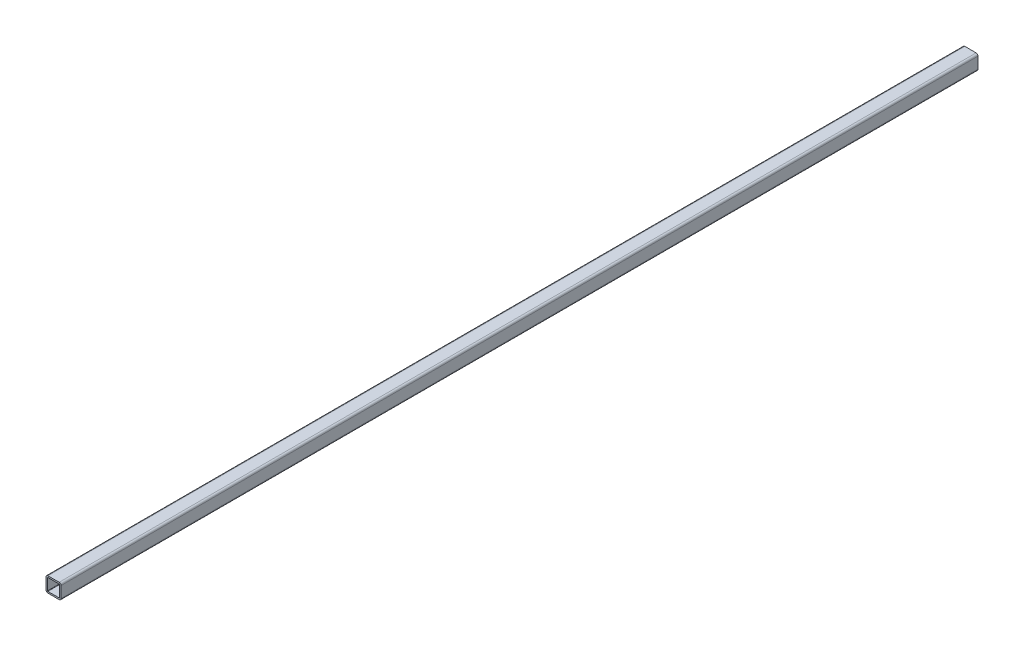
ISO-10303-21;
HEADER;
FILE_DESCRIPTION(('STEP AP214'),'2;1');
FILE_NAME('part.step','',(''),(''),'','','');
FILE_SCHEMA(('AUTOMOTIVE_DESIGN { 1 0 10303 214 1 1 1 1 }'));
ENDSEC;
DATA;
#1=APPLICATION_CONTEXT('core data for automotive mechanical design processes');
#2=APPLICATION_PROTOCOL_DEFINITION('international standard','automotive_design',2000,#1);
#3=PRODUCT_CONTEXT('',#1,'mechanical');
#4=PRODUCT('Part','Part','',(#3));
#5=PRODUCT_RELATED_PRODUCT_CATEGORY('part','',(#4));
#6=PRODUCT_DEFINITION_FORMATION('','',#4);
#7=PRODUCT_DEFINITION_CONTEXT('part definition',#1,'design');
#8=PRODUCT_DEFINITION('design','',#6,#7);
#9=PRODUCT_DEFINITION_SHAPE('','',#8);
#10=(LENGTH_UNIT() NAMED_UNIT(*) SI_UNIT(.MILLI.,.METRE.));
#11=(NAMED_UNIT(*) PLANE_ANGLE_UNIT() SI_UNIT($,.RADIAN.));
#12=(NAMED_UNIT(*) SI_UNIT($,.STERADIAN.) SOLID_ANGLE_UNIT());
#13=UNCERTAINTY_MEASURE_WITH_UNIT(LENGTH_MEASURE(1.E-05),#10,'distance_accuracy_value','');
#14=(GEOMETRIC_REPRESENTATION_CONTEXT(3) GLOBAL_UNCERTAINTY_ASSIGNED_CONTEXT((#13)) GLOBAL_UNIT_ASSIGNED_CONTEXT((#10,
#11,#12)) REPRESENTATION_CONTEXT('',''));
#15=CARTESIAN_POINT('',(0.,0.,0.));
#16=DIRECTION('',(0.,0.,1.));
#17=DIRECTION('',(1.,0.,0.));
#18=AXIS2_PLACEMENT_3D('',#15,#16,#17);
#19=CARTESIAN_POINT('',(-7.5,7.5,609.6));
#20=DIRECTION('',(0.,0.,1.));
#21=DIRECTION('',(1.,0.,0.));
#22=AXIS2_PLACEMENT_3D('',#19,#20,#21);
#23=PLANE('',#22);
#24=CARTESIAN_POINT('',(-7.5,7.5,609.6));
#25=DIRECTION('',(0.,0.,1.));
#26=DIRECTION('',(1.,0.,0.));
#27=AXIS2_PLACEMENT_3D('',#24,#25,#26);
#28=CIRCLE('',#27,2.5);
#29=CARTESIAN_POINT('',(-7.5,10.,609.6));
#30=VERTEX_POINT('',#29);
#31=CARTESIAN_POINT('',(-10.,7.5,609.6));
#32=VERTEX_POINT('',#31);
#33=EDGE_CURVE('E258',#30,#32,#28,.T.);
#34=ORIENTED_EDGE('',*,*,#33,.T.);
#35=DIRECTION('',(0.,-1.,0.));
#36=VECTOR('',#35,1.);
#37=CARTESIAN_POINT('',(-10.,-7.5,609.6));
#38=LINE('',#37,#36);
#39=CARTESIAN_POINT('',(-10.,-7.5,609.6));
#40=VERTEX_POINT('',#39);
#41=EDGE_CURVE('E261',#32,#40,#38,.T.);
#42=ORIENTED_EDGE('',*,*,#41,.T.);
#43=CARTESIAN_POINT('',(-7.5,-7.5,609.6));
#44=DIRECTION('',(0.,0.,1.));
#45=DIRECTION('',(-1.,0.,0.));
#46=AXIS2_PLACEMENT_3D('',#43,#44,#45);
#47=CIRCLE('',#46,2.5);
#48=CARTESIAN_POINT('',(-7.5,-10.,609.6));
#49=VERTEX_POINT('',#48);
#50=EDGE_CURVE('E264',#40,#49,#47,.T.);
#51=ORIENTED_EDGE('',*,*,#50,.T.);
#52=DIRECTION('',(1.,0.,0.));
#53=VECTOR('',#52,1.);
#54=CARTESIAN_POINT('',(7.5,-10.,609.6));
#55=LINE('',#54,#53);
#56=CARTESIAN_POINT('',(7.5,-10.,609.6));
#57=VERTEX_POINT('',#56);
#58=EDGE_CURVE('E266',#49,#57,#55,.T.);
#59=ORIENTED_EDGE('',*,*,#58,.T.);
#60=CARTESIAN_POINT('',(7.5,-7.5,609.6));
#61=DIRECTION('',(0.,0.,1.));
#62=DIRECTION('',(1.,0.,0.));
#63=AXIS2_PLACEMENT_3D('',#60,#61,#62);
#64=CIRCLE('',#63,2.5);
#65=CARTESIAN_POINT('',(10.,-7.5,609.6));
#66=VERTEX_POINT('',#65);
#67=EDGE_CURVE('E268',#57,#66,#64,.T.);
#68=ORIENTED_EDGE('',*,*,#67,.T.);
#69=DIRECTION('',(0.,1.,0.));
#70=VECTOR('',#69,1.);
#71=CARTESIAN_POINT('',(10.,-7.5,609.6));
#72=LINE('',#71,#70);
#73=CARTESIAN_POINT('',(10.,7.5,609.6));
#74=VERTEX_POINT('',#73);
#75=EDGE_CURVE('E270',#66,#74,#72,.T.);
#76=ORIENTED_EDGE('',*,*,#75,.T.);
#77=CARTESIAN_POINT('',(7.5,7.5,609.6));
#78=DIRECTION('',(0.,0.,1.));
#79=DIRECTION('',(1.,0.,0.));
#80=AXIS2_PLACEMENT_3D('',#77,#78,#79);
#81=CIRCLE('',#80,2.5);
#82=CARTESIAN_POINT('',(7.5,10.,609.6));
#83=VERTEX_POINT('',#82);
#84=EDGE_CURVE('E272',#74,#83,#81,.T.);
#85=ORIENTED_EDGE('',*,*,#84,.T.);
#86=DIRECTION('',(-1.,0.,0.));
#87=VECTOR('',#86,1.);
#88=CARTESIAN_POINT('',(7.5,10.,609.6));
#89=LINE('',#88,#87);
#90=EDGE_CURVE('E274',#83,#30,#89,.T.);
#91=ORIENTED_EDGE('',*,*,#90,.T.);
#92=EDGE_LOOP('',(#34,#42,#51,#59,#68,#76,#85,#91));
#93=FACE_BOUND('',#92,.T.);
#94=DIRECTION('',(0.,-1.,0.));
#95=VECTOR('',#94,1.);
#96=CARTESIAN_POINT('',(-8.,-7.5,609.6));
#97=LINE('',#96,#95);
#98=CARTESIAN_POINT('',(-8.,7.5,609.6));
#99=VERTEX_POINT('',#98);
#100=CARTESIAN_POINT('',(-8.,-7.5,609.6));
#101=VERTEX_POINT('',#100);
#102=EDGE_CURVE('E201',#99,#101,#97,.T.);
#103=ORIENTED_EDGE('',*,*,#102,.F.);
#104=CARTESIAN_POINT('',(-7.5,7.5,609.6));
#105=DIRECTION('',(0.,0.,1.));
#106=DIRECTION('',(1.,0.,0.));
#107=AXIS2_PLACEMENT_3D('',#104,#105,#106);
#108=CIRCLE('',#107,0.499999999999999);
#109=CARTESIAN_POINT('',(-7.5,8.,609.6));
#110=VERTEX_POINT('',#109);
#111=EDGE_CURVE('E193',#110,#99,#108,.T.);
#112=ORIENTED_EDGE('',*,*,#111,.F.);
#113=DIRECTION('',(-1.,0.,0.));
#114=VECTOR('',#113,1.);
#115=CARTESIAN_POINT('',(7.5,8.,609.6));
#116=LINE('',#115,#114);
#117=CARTESIAN_POINT('',(7.5,8.,609.6));
#118=VERTEX_POINT('',#117);
#119=EDGE_CURVE('E226',#118,#110,#116,.T.);
#120=ORIENTED_EDGE('',*,*,#119,.F.);
#121=CARTESIAN_POINT('',(7.5,7.5,609.6));
#122=DIRECTION('',(0.,0.,1.));
#123=DIRECTION('',(1.,0.,0.));
#124=AXIS2_PLACEMENT_3D('',#121,#122,#123);
#125=CIRCLE('',#124,0.499999999999999);
#126=CARTESIAN_POINT('',(8.,7.5,609.6));
#127=VERTEX_POINT('',#126);
#128=EDGE_CURVE('E224',#127,#118,#125,.T.);
#129=ORIENTED_EDGE('',*,*,#128,.F.);
#130=DIRECTION('',(0.,1.,0.));
#131=VECTOR('',#130,1.);
#132=CARTESIAN_POINT('',(8.,-7.5,609.6));
#133=LINE('',#132,#131);
#134=CARTESIAN_POINT('',(8.,-7.5,609.6));
#135=VERTEX_POINT('',#134);
#136=EDGE_CURVE('E222',#135,#127,#133,.T.);
#137=ORIENTED_EDGE('',*,*,#136,.F.);
#138=CARTESIAN_POINT('',(7.5,-7.5,609.6));
#139=DIRECTION('',(0.,0.,1.));
#140=DIRECTION('',(1.,0.,0.));
#141=AXIS2_PLACEMENT_3D('',#138,#139,#140);
#142=CIRCLE('',#141,0.500000000000001);
#143=CARTESIAN_POINT('',(7.5,-8.,609.6));
#144=VERTEX_POINT('',#143);
#145=EDGE_CURVE('E220',#144,#135,#142,.T.);
#146=ORIENTED_EDGE('',*,*,#145,.F.);
#147=DIRECTION('',(1.,0.,0.));
#148=VECTOR('',#147,1.);
#149=CARTESIAN_POINT('',(7.5,-8.,609.6));
#150=LINE('',#149,#148);
#151=CARTESIAN_POINT('',(-7.5,-8.,609.6));
#152=VERTEX_POINT('',#151);
#153=EDGE_CURVE('E216',#152,#144,#150,.T.);
#154=ORIENTED_EDGE('',*,*,#153,.F.);
#155=CARTESIAN_POINT('',(-7.5,-7.5,609.6));
#156=DIRECTION('',(0.,0.,1.));
#157=DIRECTION('',(1.,0.,0.));
#158=AXIS2_PLACEMENT_3D('',#155,#156,#157);
#159=CIRCLE('',#158,0.500000000000002);
#160=EDGE_CURVE('E214',#101,#152,#159,.T.);
#161=ORIENTED_EDGE('',*,*,#160,.F.);
#162=EDGE_LOOP('',(#103,#112,#120,#129,#137,#146,#154,#161));
#163=FACE_BOUND('',#162,.T.);
#164=ADVANCED_FACE('F80',(#93,#163),#23,.T.);
#165=CARTESIAN_POINT('',(-7.5,7.5,-609.6));
#166=DIRECTION('',(0.,0.,1.));
#167=DIRECTION('',(1.,0.,0.));
#168=AXIS2_PLACEMENT_3D('',#165,#166,#167);
#169=PLANE('',#168);
#170=CARTESIAN_POINT('',(-7.5,7.5,-609.6));
#171=DIRECTION('',(0.,0.,1.));
#172=DIRECTION('',(1.,0.,0.));
#173=AXIS2_PLACEMENT_3D('',#170,#171,#172);
#174=CIRCLE('',#173,2.5);
#175=CARTESIAN_POINT('',(-7.5,10.,-609.6));
#176=VERTEX_POINT('',#175);
#177=CARTESIAN_POINT('',(-10.,7.5,-609.6));
#178=VERTEX_POINT('',#177);
#179=EDGE_CURVE('E209',#176,#178,#174,.T.);
#180=ORIENTED_EDGE('',*,*,#179,.F.);
#181=DIRECTION('',(-1.,0.,0.));
#182=VECTOR('',#181,1.);
#183=CARTESIAN_POINT('',(7.5,10.,-609.6));
#184=LINE('',#183,#182);
#185=CARTESIAN_POINT('',(7.5,10.,-609.6));
#186=VERTEX_POINT('',#185);
#187=EDGE_CURVE('E262',#186,#176,#184,.T.);
#188=ORIENTED_EDGE('',*,*,#187,.F.);
#189=CARTESIAN_POINT('',(7.5,7.5,-609.6));
#190=DIRECTION('',(0.,0.,1.));
#191=DIRECTION('',(1.,0.,0.));
#192=AXIS2_PLACEMENT_3D('',#189,#190,#191);
#193=CIRCLE('',#192,2.5);
#194=CARTESIAN_POINT('',(10.,7.5,-609.6));
#195=VERTEX_POINT('',#194);
#196=EDGE_CURVE('E289',#195,#186,#193,.T.);
#197=ORIENTED_EDGE('',*,*,#196,.F.);
#198=DIRECTION('',(0.,1.,0.));
#199=VECTOR('',#198,1.);
#200=CARTESIAN_POINT('',(10.,-7.5,-609.6));
#201=LINE('',#200,#199);
#202=CARTESIAN_POINT('',(10.,-7.5,-609.6));
#203=VERTEX_POINT('',#202);
#204=EDGE_CURVE('E287',#203,#195,#201,.T.);
#205=ORIENTED_EDGE('',*,*,#204,.F.);
#206=CARTESIAN_POINT('',(7.5,-7.5,-609.6));
#207=DIRECTION('',(0.,0.,1.));
#208=DIRECTION('',(1.,0.,0.));
#209=AXIS2_PLACEMENT_3D('',#206,#207,#208);
#210=CIRCLE('',#209,2.5);
#211=CARTESIAN_POINT('',(7.5,-10.,-609.6));
#212=VERTEX_POINT('',#211);
#213=EDGE_CURVE('E285',#212,#203,#210,.T.);
#214=ORIENTED_EDGE('',*,*,#213,.F.);
#215=DIRECTION('',(1.,0.,0.));
#216=VECTOR('',#215,1.);
#217=CARTESIAN_POINT('',(7.5,-10.,-609.6));
#218=LINE('',#217,#216);
#219=CARTESIAN_POINT('',(-7.5,-10.,-609.6));
#220=VERTEX_POINT('',#219);
#221=EDGE_CURVE('E283',#220,#212,#218,.T.);
#222=ORIENTED_EDGE('',*,*,#221,.F.);
#223=CARTESIAN_POINT('',(-7.5,-7.5,-609.6));
#224=DIRECTION('',(0.,0.,1.));
#225=DIRECTION('',(-1.,0.,0.));
#226=AXIS2_PLACEMENT_3D('',#223,#224,#225);
#227=CIRCLE('',#226,2.5);
#228=CARTESIAN_POINT('',(-10.,-7.5,-609.6));
#229=VERTEX_POINT('',#228);
#230=EDGE_CURVE('E281',#229,#220,#227,.T.);
#231=ORIENTED_EDGE('',*,*,#230,.F.);
#232=DIRECTION('',(0.,-1.,0.));
#233=VECTOR('',#232,1.);
#234=CARTESIAN_POINT('',(-10.,-7.5,-609.6));
#235=LINE('',#234,#233);
#236=EDGE_CURVE('E279',#178,#229,#235,.T.);
#237=ORIENTED_EDGE('',*,*,#236,.F.);
#238=EDGE_LOOP('',(#180,#188,#197,#205,#214,#222,#231,#237));
#239=FACE_BOUND('',#238,.T.);
#240=CARTESIAN_POINT('',(-7.5,7.5,-609.6));
#241=DIRECTION('',(0.,0.,1.));
#242=DIRECTION('',(1.,0.,0.));
#243=AXIS2_PLACEMENT_3D('',#240,#241,#242);
#244=CIRCLE('',#243,0.499999999999999);
#245=CARTESIAN_POINT('',(-7.5,8.,-609.6));
#246=VERTEX_POINT('',#245);
#247=CARTESIAN_POINT('',(-8.,7.5,-609.6));
#248=VERTEX_POINT('',#247);
#249=EDGE_CURVE('E103',#246,#248,#244,.T.);
#250=ORIENTED_EDGE('',*,*,#249,.T.);
#251=DIRECTION('',(0.,-1.,0.));
#252=VECTOR('',#251,1.);
#253=CARTESIAN_POINT('',(-8.,-7.5,-609.6));
#254=LINE('',#253,#252);
#255=CARTESIAN_POINT('',(-8.,-7.5,-609.6));
#256=VERTEX_POINT('',#255);
#257=EDGE_CURVE('E208',#248,#256,#254,.T.);
#258=ORIENTED_EDGE('',*,*,#257,.T.);
#259=CARTESIAN_POINT('',(-7.5,-7.5,-609.6));
#260=DIRECTION('',(0.,0.,1.));
#261=DIRECTION('',(1.,0.,0.));
#262=AXIS2_PLACEMENT_3D('',#259,#260,#261);
#263=CIRCLE('',#262,0.500000000000002);
#264=CARTESIAN_POINT('',(-7.5,-8.,-609.6));
#265=VERTEX_POINT('',#264);
#266=EDGE_CURVE('E230',#256,#265,#263,.T.);
#267=ORIENTED_EDGE('',*,*,#266,.T.);
#268=DIRECTION('',(1.,0.,0.));
#269=VECTOR('',#268,1.);
#270=CARTESIAN_POINT('',(7.5,-8.,-609.6));
#271=LINE('',#270,#269);
#272=CARTESIAN_POINT('',(7.5,-8.,-609.6));
#273=VERTEX_POINT('',#272);
#274=EDGE_CURVE('E233',#265,#273,#271,.T.);
#275=ORIENTED_EDGE('',*,*,#274,.T.);
#276=CARTESIAN_POINT('',(7.5,-7.5,-609.6));
#277=DIRECTION('',(0.,0.,1.));
#278=DIRECTION('',(1.,0.,0.));
#279=AXIS2_PLACEMENT_3D('',#276,#277,#278);
#280=CIRCLE('',#279,0.500000000000001);
#281=CARTESIAN_POINT('',(8.,-7.5,-609.6));
#282=VERTEX_POINT('',#281);
#283=EDGE_CURVE('E236',#273,#282,#280,.T.);
#284=ORIENTED_EDGE('',*,*,#283,.T.);
#285=DIRECTION('',(0.,1.,0.));
#286=VECTOR('',#285,1.);
#287=CARTESIAN_POINT('',(8.,-7.5,-609.6));
#288=LINE('',#287,#286);
#289=CARTESIAN_POINT('',(8.,7.5,-609.6));
#290=VERTEX_POINT('',#289);
#291=EDGE_CURVE('E239',#282,#290,#288,.T.);
#292=ORIENTED_EDGE('',*,*,#291,.T.);
#293=CARTESIAN_POINT('',(7.5,7.5,-609.6));
#294=DIRECTION('',(0.,0.,1.));
#295=DIRECTION('',(1.,0.,0.));
#296=AXIS2_PLACEMENT_3D('',#293,#294,#295);
#297=CIRCLE('',#296,0.499999999999999);
#298=CARTESIAN_POINT('',(7.5,8.,-609.6));
#299=VERTEX_POINT('',#298);
#300=EDGE_CURVE('E242',#290,#299,#297,.T.);
#301=ORIENTED_EDGE('',*,*,#300,.T.);
#302=DIRECTION('',(-1.,0.,0.));
#303=VECTOR('',#302,1.);
#304=CARTESIAN_POINT('',(7.5,8.,-609.6));
#305=LINE('',#304,#303);
#306=EDGE_CURVE('E202',#299,#246,#305,.T.);
#307=ORIENTED_EDGE('',*,*,#306,.T.);
#308=EDGE_LOOP('',(#250,#258,#267,#275,#284,#292,#301,#307));
#309=FACE_BOUND('',#308,.T.);
#310=ADVANCED_FACE('F319',(#239,#309),#169,.F.);
#311=CARTESIAN_POINT('',(-7.5,7.5,609.6));
#312=DIRECTION('',(0.,0.,-1.));
#313=DIRECTION('',(-1.,0.,0.));
#314=AXIS2_PLACEMENT_3D('',#311,#312,#313);
#315=CYLINDRICAL_SURFACE('',#314,2.5);
#316=ORIENTED_EDGE('',*,*,#179,.T.);
#317=DIRECTION('',(0.,0.,-1.));
#318=VECTOR('',#317,1.);
#319=CARTESIAN_POINT('',(-10.,7.5,609.6));
#320=LINE('',#319,#318);
#321=EDGE_CURVE('E12',#32,#178,#320,.T.);
#322=ORIENTED_EDGE('',*,*,#321,.F.);
#323=ORIENTED_EDGE('',*,*,#33,.F.);
#324=DIRECTION('',(0.,0.,-1.));
#325=VECTOR('',#324,1.);
#326=CARTESIAN_POINT('',(-7.5,10.,609.6));
#327=LINE('',#326,#325);
#328=EDGE_CURVE('E276',#30,#176,#327,.T.);
#329=ORIENTED_EDGE('',*,*,#328,.T.);
#330=EDGE_LOOP('',(#316,#322,#323,#329));
#331=FACE_BOUND('',#330,.T.);
#332=ADVANCED_FACE('F82',(#331),#315,.T.);
#333=CARTESIAN_POINT('',(-10.,-7.5,609.6));
#334=DIRECTION('',(1.,0.,0.));
#335=DIRECTION('',(0.,1.,0.));
#336=AXIS2_PLACEMENT_3D('',#333,#334,#335);
#337=PLANE('',#336);
#338=ORIENTED_EDGE('',*,*,#236,.T.);
#339=DIRECTION('',(0.,0.,-1.));
#340=VECTOR('',#339,1.);
#341=CARTESIAN_POINT('',(-10.,-7.5,609.6));
#342=LINE('',#341,#340);
#343=EDGE_CURVE('E88',#40,#229,#342,.T.);
#344=ORIENTED_EDGE('',*,*,#343,.F.);
#345=ORIENTED_EDGE('',*,*,#41,.F.);
#346=ORIENTED_EDGE('',*,*,#321,.T.);
#347=EDGE_LOOP('',(#338,#344,#345,#346));
#348=FACE_BOUND('',#347,.T.);
#349=ADVANCED_FACE('F336',(#348),#337,.F.);
#350=CARTESIAN_POINT('',(-7.5,-7.5,609.6));
#351=DIRECTION('',(0.,0.,-1.));
#352=DIRECTION('',(-1.,0.,0.));
#353=AXIS2_PLACEMENT_3D('',#350,#351,#352);
#354=CYLINDRICAL_SURFACE('',#353,2.5);
#355=ORIENTED_EDGE('',*,*,#230,.T.);
#356=DIRECTION('',(0.,0.,-1.));
#357=VECTOR('',#356,1.);
#358=CARTESIAN_POINT('',(-7.5,-10.,609.6));
#359=LINE('',#358,#357);
#360=EDGE_CURVE('E306',#49,#220,#359,.T.);
#361=ORIENTED_EDGE('',*,*,#360,.F.);
#362=ORIENTED_EDGE('',*,*,#50,.F.);
#363=ORIENTED_EDGE('',*,*,#343,.T.);
#364=EDGE_LOOP('',(#355,#361,#362,#363));
#365=FACE_BOUND('',#364,.T.);
#366=ADVANCED_FACE('F313',(#365),#354,.T.);
#367=CARTESIAN_POINT('',(7.5,-10.,609.6));
#368=DIRECTION('',(0.,1.,0.));
#369=DIRECTION('',(-1.,0.,0.));
#370=AXIS2_PLACEMENT_3D('',#367,#368,#369);
#371=PLANE('',#370);
#372=ORIENTED_EDGE('',*,*,#221,.T.);
#373=DIRECTION('',(0.,0.,-1.));
#374=VECTOR('',#373,1.);
#375=CARTESIAN_POINT('',(7.5,-10.,609.6));
#376=LINE('',#375,#374);
#377=EDGE_CURVE('E303',#57,#212,#376,.T.);
#378=ORIENTED_EDGE('',*,*,#377,.F.);
#379=ORIENTED_EDGE('',*,*,#58,.F.);
#380=ORIENTED_EDGE('',*,*,#360,.T.);
#381=EDGE_LOOP('',(#372,#378,#379,#380));
#382=FACE_BOUND('',#381,.T.);
#383=ADVANCED_FACE('F325',(#382),#371,.F.);
#384=CARTESIAN_POINT('',(7.5,-7.5,609.6));
#385=DIRECTION('',(0.,0.,-1.));
#386=DIRECTION('',(-1.,0.,0.));
#387=AXIS2_PLACEMENT_3D('',#384,#385,#386);
#388=CYLINDRICAL_SURFACE('',#387,2.5);
#389=ORIENTED_EDGE('',*,*,#213,.T.);
#390=DIRECTION('',(0.,0.,-1.));
#391=VECTOR('',#390,1.);
#392=CARTESIAN_POINT('',(10.,-7.5,609.6));
#393=LINE('',#392,#391);
#394=EDGE_CURVE('E300',#66,#203,#393,.T.);
#395=ORIENTED_EDGE('',*,*,#394,.F.);
#396=ORIENTED_EDGE('',*,*,#67,.F.);
#397=ORIENTED_EDGE('',*,*,#377,.T.);
#398=EDGE_LOOP('',(#389,#395,#396,#397));
#399=FACE_BOUND('',#398,.T.);
#400=ADVANCED_FACE('F329',(#399),#388,.T.);
#401=CARTESIAN_POINT('',(10.,-7.5,609.6));
#402=DIRECTION('',(-1.,0.,0.));
#403=DIRECTION('',(0.,-1.,0.));
#404=AXIS2_PLACEMENT_3D('',#401,#402,#403);
#405=PLANE('',#404);
#406=ORIENTED_EDGE('',*,*,#204,.T.);
#407=DIRECTION('',(0.,0.,-1.));
#408=VECTOR('',#407,1.);
#409=CARTESIAN_POINT('',(10.,7.5,609.6));
#410=LINE('',#409,#408);
#411=EDGE_CURVE('E297',#74,#195,#410,.T.);
#412=ORIENTED_EDGE('',*,*,#411,.F.);
#413=ORIENTED_EDGE('',*,*,#75,.F.);
#414=ORIENTED_EDGE('',*,*,#394,.T.);
#415=EDGE_LOOP('',(#406,#412,#413,#414));
#416=FACE_BOUND('',#415,.T.);
#417=ADVANCED_FACE('F349',(#416),#405,.F.);
#418=CARTESIAN_POINT('',(7.5,7.5,609.6));
#419=DIRECTION('',(0.,0.,-1.));
#420=DIRECTION('',(-1.,0.,0.));
#421=AXIS2_PLACEMENT_3D('',#418,#419,#420);
#422=CYLINDRICAL_SURFACE('',#421,2.5);
#423=ORIENTED_EDGE('',*,*,#196,.T.);
#424=DIRECTION('',(0.,0.,-1.));
#425=VECTOR('',#424,1.);
#426=CARTESIAN_POINT('',(7.5,10.,609.6));
#427=LINE('',#426,#425);
#428=EDGE_CURVE('E294',#83,#186,#427,.T.);
#429=ORIENTED_EDGE('',*,*,#428,.F.);
#430=ORIENTED_EDGE('',*,*,#84,.F.);
#431=ORIENTED_EDGE('',*,*,#411,.T.);
#432=EDGE_LOOP('',(#423,#429,#430,#431));
#433=FACE_BOUND('',#432,.T.);
#434=ADVANCED_FACE('F347',(#433),#422,.T.);
#435=CARTESIAN_POINT('',(7.5,10.,609.6));
#436=DIRECTION('',(0.,-1.,0.));
#437=DIRECTION('',(1.,0.,0.));
#438=AXIS2_PLACEMENT_3D('',#435,#436,#437);
#439=PLANE('',#438);
#440=ORIENTED_EDGE('',*,*,#187,.T.);
#441=ORIENTED_EDGE('',*,*,#328,.F.);
#442=ORIENTED_EDGE('',*,*,#90,.F.);
#443=ORIENTED_EDGE('',*,*,#428,.T.);
#444=EDGE_LOOP('',(#440,#441,#442,#443));
#445=FACE_BOUND('',#444,.T.);
#446=ADVANCED_FACE('F342',(#445),#439,.F.);
#447=CARTESIAN_POINT('',(-7.5,7.5,609.6));
#448=DIRECTION('',(0.,0.,-1.));
#449=DIRECTION('',(-1.,0.,0.));
#450=AXIS2_PLACEMENT_3D('',#447,#448,#449);
#451=CYLINDRICAL_SURFACE('',#450,0.499999999999999);
#452=ORIENTED_EDGE('',*,*,#249,.F.);
#453=DIRECTION('',(0.,0.,-1.));
#454=VECTOR('',#453,1.);
#455=CARTESIAN_POINT('',(-7.5,8.,609.6));
#456=LINE('',#455,#454);
#457=EDGE_CURVE('E197',#110,#246,#456,.T.);
#458=ORIENTED_EDGE('',*,*,#457,.F.);
#459=ORIENTED_EDGE('',*,*,#111,.T.);
#460=DIRECTION('',(0.,0.,-1.));
#461=VECTOR('',#460,1.);
#462=CARTESIAN_POINT('',(-8.,7.5,609.6));
#463=LINE('',#462,#461);
#464=EDGE_CURVE('E196',#99,#248,#463,.T.);
#465=ORIENTED_EDGE('',*,*,#464,.T.);
#466=EDGE_LOOP('',(#452,#458,#459,#465));
#467=FACE_BOUND('',#466,.T.);
#468=ADVANCED_FACE('F195',(#467),#451,.F.);
#469=CARTESIAN_POINT('',(-8.,-7.5,609.6));
#470=DIRECTION('',(1.,0.,0.));
#471=DIRECTION('',(0.,1.,0.));
#472=AXIS2_PLACEMENT_3D('',#469,#470,#471);
#473=PLANE('',#472);
#474=ORIENTED_EDGE('',*,*,#257,.F.);
#475=ORIENTED_EDGE('',*,*,#464,.F.);
#476=ORIENTED_EDGE('',*,*,#102,.T.);
#477=DIRECTION('',(0.,0.,-1.));
#478=VECTOR('',#477,1.);
#479=CARTESIAN_POINT('',(-8.,-7.5,609.6));
#480=LINE('',#479,#478);
#481=EDGE_CURVE('E210',#101,#256,#480,.T.);
#482=ORIENTED_EDGE('',*,*,#481,.T.);
#483=EDGE_LOOP('',(#474,#475,#476,#482));
#484=FACE_BOUND('',#483,.T.);
#485=ADVANCED_FACE('F205',(#484),#473,.T.);
#486=CARTESIAN_POINT('',(-7.5,-7.5,609.6));
#487=DIRECTION('',(0.,0.,-1.));
#488=DIRECTION('',(-1.,0.,0.));
#489=AXIS2_PLACEMENT_3D('',#486,#487,#488);
#490=CYLINDRICAL_SURFACE('',#489,0.500000000000002);
#491=ORIENTED_EDGE('',*,*,#266,.F.);
#492=ORIENTED_EDGE('',*,*,#481,.F.);
#493=ORIENTED_EDGE('',*,*,#160,.T.);
#494=DIRECTION('',(0.,0.,-1.));
#495=VECTOR('',#494,1.);
#496=CARTESIAN_POINT('',(-7.5,-8.,609.6));
#497=LINE('',#496,#495);
#498=EDGE_CURVE('E255',#152,#265,#497,.T.);
#499=ORIENTED_EDGE('',*,*,#498,.T.);
#500=EDGE_LOOP('',(#491,#492,#493,#499));
#501=FACE_BOUND('',#500,.T.);
#502=ADVANCED_FACE('F374',(#501),#490,.F.);
#503=CARTESIAN_POINT('',(7.5,-8.,609.6));
#504=DIRECTION('',(0.,1.,0.));
#505=DIRECTION('',(-1.,0.,0.));
#506=AXIS2_PLACEMENT_3D('',#503,#504,#505);
#507=PLANE('',#506);
#508=ORIENTED_EDGE('',*,*,#274,.F.);
#509=ORIENTED_EDGE('',*,*,#498,.F.);
#510=ORIENTED_EDGE('',*,*,#153,.T.);
#511=DIRECTION('',(0.,0.,-1.));
#512=VECTOR('',#511,1.);
#513=CARTESIAN_POINT('',(7.5,-8.,609.6));
#514=LINE('',#513,#512);
#515=EDGE_CURVE('E253',#144,#273,#514,.T.);
#516=ORIENTED_EDGE('',*,*,#515,.T.);
#517=EDGE_LOOP('',(#508,#509,#510,#516));
#518=FACE_BOUND('',#517,.T.);
#519=ADVANCED_FACE('F378',(#518),#507,.T.);
#520=CARTESIAN_POINT('',(7.5,-7.5,609.6));
#521=DIRECTION('',(0.,0.,-1.));
#522=DIRECTION('',(-1.,0.,0.));
#523=AXIS2_PLACEMENT_3D('',#520,#521,#522);
#524=CYLINDRICAL_SURFACE('',#523,0.500000000000001);
#525=ORIENTED_EDGE('',*,*,#283,.F.);
#526=ORIENTED_EDGE('',*,*,#515,.F.);
#527=ORIENTED_EDGE('',*,*,#145,.T.);
#528=DIRECTION('',(0.,0.,-1.));
#529=VECTOR('',#528,1.);
#530=CARTESIAN_POINT('',(8.,-7.5,609.6));
#531=LINE('',#530,#529);
#532=EDGE_CURVE('E251',#135,#282,#531,.T.);
#533=ORIENTED_EDGE('',*,*,#532,.T.);
#534=EDGE_LOOP('',(#525,#526,#527,#533));
#535=FACE_BOUND('',#534,.T.);
#536=ADVANCED_FACE('F384',(#535),#524,.F.);
#537=CARTESIAN_POINT('',(8.,-7.5,609.6));
#538=DIRECTION('',(-1.,0.,0.));
#539=DIRECTION('',(0.,-1.,0.));
#540=AXIS2_PLACEMENT_3D('',#537,#538,#539);
#541=PLANE('',#540);
#542=ORIENTED_EDGE('',*,*,#291,.F.);
#543=ORIENTED_EDGE('',*,*,#532,.F.);
#544=ORIENTED_EDGE('',*,*,#136,.T.);
#545=DIRECTION('',(0.,0.,-1.));
#546=VECTOR('',#545,1.);
#547=CARTESIAN_POINT('',(8.,7.5,609.6));
#548=LINE('',#547,#546);
#549=EDGE_CURVE('E249',#127,#290,#548,.T.);
#550=ORIENTED_EDGE('',*,*,#549,.T.);
#551=EDGE_LOOP('',(#542,#543,#544,#550));
#552=FACE_BOUND('',#551,.T.);
#553=ADVANCED_FACE('F388',(#552),#541,.T.);
#554=CARTESIAN_POINT('',(7.5,7.5,609.6));
#555=DIRECTION('',(0.,0.,-1.));
#556=DIRECTION('',(-1.,0.,0.));
#557=AXIS2_PLACEMENT_3D('',#554,#555,#556);
#558=CYLINDRICAL_SURFACE('',#557,0.499999999999999);
#559=ORIENTED_EDGE('',*,*,#300,.F.);
#560=ORIENTED_EDGE('',*,*,#549,.F.);
#561=ORIENTED_EDGE('',*,*,#128,.T.);
#562=DIRECTION('',(0.,0.,-1.));
#563=VECTOR('',#562,1.);
#564=CARTESIAN_POINT('',(7.5,8.,609.6));
#565=LINE('',#564,#563);
#566=EDGE_CURVE('E95',#118,#299,#565,.T.);
#567=ORIENTED_EDGE('',*,*,#566,.T.);
#568=EDGE_LOOP('',(#559,#560,#561,#567));
#569=FACE_BOUND('',#568,.T.);
#570=ADVANCED_FACE('F392',(#569),#558,.F.);
#571=CARTESIAN_POINT('',(7.5,8.,609.6));
#572=DIRECTION('',(0.,-1.,0.));
#573=DIRECTION('',(1.,0.,0.));
#574=AXIS2_PLACEMENT_3D('',#571,#572,#573);
#575=PLANE('',#574);
#576=ORIENTED_EDGE('',*,*,#306,.F.);
#577=ORIENTED_EDGE('',*,*,#566,.F.);
#578=ORIENTED_EDGE('',*,*,#119,.T.);
#579=ORIENTED_EDGE('',*,*,#457,.T.);
#580=EDGE_LOOP('',(#576,#577,#578,#579));
#581=FACE_BOUND('',#580,.T.);
#582=ADVANCED_FACE('F396',(#581),#575,.T.);
#583=CLOSED_SHELL('',(#164,#310,#332,#349,#366,#383,#400,#417,#434,#446,#468,#485,#502,#519,
#536,#553,#570,#582));
#584=MANIFOLD_SOLID_BREP('B2',#583);
#585=ADVANCED_BREP_SHAPE_REPRESENTATION('',(#18,#584),#14);
#586=SHAPE_DEFINITION_REPRESENTATION(#9,#585);
ENDSEC;
END-ISO-10303-21;
